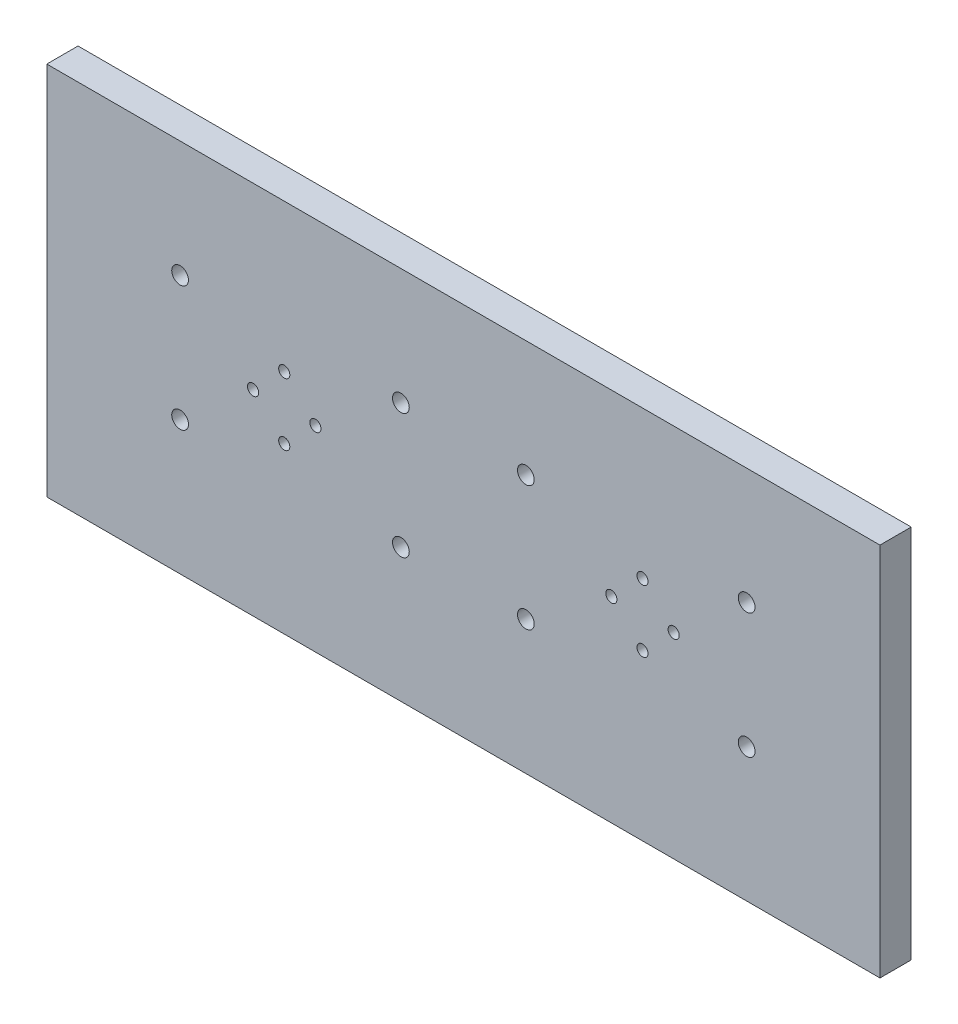
ISO-10303-21;
HEADER;
FILE_DESCRIPTION(('STEP AP214'),'2;1');
FILE_NAME('part.step','',(''),(''),'','','');
FILE_SCHEMA(('AUTOMOTIVE_DESIGN { 1 0 10303 214 1 1 1 1 }'));
ENDSEC;
DATA;
#1=APPLICATION_CONTEXT('core data for automotive mechanical design processes');
#2=APPLICATION_PROTOCOL_DEFINITION('international standard','automotive_design',2000,#1);
#3=PRODUCT_CONTEXT('',#1,'mechanical');
#4=PRODUCT('Part','Part','',(#3));
#5=PRODUCT_RELATED_PRODUCT_CATEGORY('part','',(#4));
#6=PRODUCT_DEFINITION_FORMATION('','',#4);
#7=PRODUCT_DEFINITION_CONTEXT('part definition',#1,'design');
#8=PRODUCT_DEFINITION('design','',#6,#7);
#9=PRODUCT_DEFINITION_SHAPE('','',#8);
#10=(LENGTH_UNIT() NAMED_UNIT(*) SI_UNIT(.MILLI.,.METRE.));
#11=(NAMED_UNIT(*) PLANE_ANGLE_UNIT() SI_UNIT($,.RADIAN.));
#12=(NAMED_UNIT(*) SI_UNIT($,.STERADIAN.) SOLID_ANGLE_UNIT());
#13=UNCERTAINTY_MEASURE_WITH_UNIT(LENGTH_MEASURE(1.E-05),#10,'distance_accuracy_value','');
#14=(GEOMETRIC_REPRESENTATION_CONTEXT(3) GLOBAL_UNCERTAINTY_ASSIGNED_CONTEXT((#13)) GLOBAL_UNIT_ASSIGNED_CONTEXT((#10,
#11,#12)) REPRESENTATION_CONTEXT('',''));
#15=CARTESIAN_POINT('',(0.,0.,0.));
#16=DIRECTION('',(0.,0.,1.));
#17=DIRECTION('',(1.,0.,0.));
#18=AXIS2_PLACEMENT_3D('',#15,#16,#17);
#19=CARTESIAN_POINT('',(127.,-57.15,9.525));
#20=DIRECTION('',(-1.,0.,0.));
#21=DIRECTION('',(0.,0.,1.));
#22=AXIS2_PLACEMENT_3D('',#19,#20,#21);
#23=PLANE('',#22);
#24=DIRECTION('',(0.,1.,0.));
#25=VECTOR('',#24,1.);
#26=CARTESIAN_POINT('',(127.,-57.15,0.));
#27=LINE('',#26,#25);
#28=CARTESIAN_POINT('',(127.,-57.15,0.));
#29=VERTEX_POINT('',#28);
#30=CARTESIAN_POINT('',(127.,57.15,0.));
#31=VERTEX_POINT('',#30);
#32=EDGE_CURVE('E108',#29,#31,#27,.T.);
#33=ORIENTED_EDGE('',*,*,#32,.T.);
#34=DIRECTION('',(0.,0.,-1.));
#35=VECTOR('',#34,1.);
#36=CARTESIAN_POINT('',(127.,57.15,9.525));
#37=LINE('',#36,#35);
#38=CARTESIAN_POINT('',(127.,57.15,9.525));
#39=VERTEX_POINT('',#38);
#40=EDGE_CURVE('E11',#39,#31,#37,.T.);
#41=ORIENTED_EDGE('',*,*,#40,.F.);
#42=DIRECTION('',(0.,1.,0.));
#43=VECTOR('',#42,1.);
#44=CARTESIAN_POINT('',(127.,-57.15,9.525));
#45=LINE('',#44,#43);
#46=CARTESIAN_POINT('',(127.,-57.15,9.525));
#47=VERTEX_POINT('',#46);
#48=EDGE_CURVE('E96',#47,#39,#45,.T.);
#49=ORIENTED_EDGE('',*,*,#48,.F.);
#50=DIRECTION('',(0.,0.,-1.));
#51=VECTOR('',#50,1.);
#52=CARTESIAN_POINT('',(127.,-57.15,9.525));
#53=LINE('',#52,#51);
#54=EDGE_CURVE('E104',#47,#29,#53,.T.);
#55=ORIENTED_EDGE('',*,*,#54,.T.);
#56=EDGE_LOOP('',(#33,#41,#49,#55));
#57=FACE_BOUND('',#56,.T.);
#58=ADVANCED_FACE('F44',(#57),#23,.F.);
#59=CARTESIAN_POINT('',(-127.,57.15,9.525));
#60=DIRECTION('',(0.,-1.,0.));
#61=DIRECTION('',(0.,0.,-1.));
#62=AXIS2_PLACEMENT_3D('',#59,#60,#61);
#63=PLANE('',#62);
#64=DIRECTION('',(-1.,0.,0.));
#65=VECTOR('',#64,1.);
#66=CARTESIAN_POINT('',(-127.,57.15,0.));
#67=LINE('',#66,#65);
#68=CARTESIAN_POINT('',(-127.,57.15,0.));
#69=VERTEX_POINT('',#68);
#70=EDGE_CURVE('E100',#31,#69,#67,.T.);
#71=ORIENTED_EDGE('',*,*,#70,.T.);
#72=DIRECTION('',(0.,0.,-1.));
#73=VECTOR('',#72,1.);
#74=CARTESIAN_POINT('',(-127.,57.15,9.525));
#75=LINE('',#74,#73);
#76=CARTESIAN_POINT('',(-127.,57.15,9.525));
#77=VERTEX_POINT('',#76);
#78=EDGE_CURVE('E52',#77,#69,#75,.T.);
#79=ORIENTED_EDGE('',*,*,#78,.F.);
#80=DIRECTION('',(-1.,0.,0.));
#81=VECTOR('',#80,1.);
#82=CARTESIAN_POINT('',(-127.,57.15,9.525));
#83=LINE('',#82,#81);
#84=EDGE_CURVE('E90',#39,#77,#83,.T.);
#85=ORIENTED_EDGE('',*,*,#84,.F.);
#86=ORIENTED_EDGE('',*,*,#40,.T.);
#87=EDGE_LOOP('',(#71,#79,#85,#86));
#88=FACE_BOUND('',#87,.T.);
#89=ADVANCED_FACE('F99',(#88),#63,.F.);
#90=CARTESIAN_POINT('',(-127.,-57.15,9.525));
#91=DIRECTION('',(1.,0.,0.));
#92=DIRECTION('',(0.,0.,-1.));
#93=AXIS2_PLACEMENT_3D('',#90,#91,#92);
#94=PLANE('',#93);
#95=DIRECTION('',(0.,-1.,0.));
#96=VECTOR('',#95,1.);
#97=CARTESIAN_POINT('',(-127.,-57.15,0.));
#98=LINE('',#97,#96);
#99=CARTESIAN_POINT('',(-127.,-57.15,0.));
#100=VERTEX_POINT('',#99);
#101=EDGE_CURVE('E77',#69,#100,#98,.T.);
#102=ORIENTED_EDGE('',*,*,#101,.T.);
#103=DIRECTION('',(0.,0.,-1.));
#104=VECTOR('',#103,1.);
#105=CARTESIAN_POINT('',(-127.,-57.15,9.525));
#106=LINE('',#105,#104);
#107=CARTESIAN_POINT('',(-127.,-57.15,9.525));
#108=VERTEX_POINT('',#107);
#109=EDGE_CURVE('E101',#108,#100,#106,.T.);
#110=ORIENTED_EDGE('',*,*,#109,.F.);
#111=DIRECTION('',(0.,-1.,0.));
#112=VECTOR('',#111,1.);
#113=CARTESIAN_POINT('',(-127.,-57.15,9.525));
#114=LINE('',#113,#112);
#115=EDGE_CURVE('E94',#77,#108,#114,.T.);
#116=ORIENTED_EDGE('',*,*,#115,.F.);
#117=ORIENTED_EDGE('',*,*,#78,.T.);
#118=EDGE_LOOP('',(#102,#110,#116,#117));
#119=FACE_BOUND('',#118,.T.);
#120=ADVANCED_FACE('F102',(#119),#94,.F.);
#121=CARTESIAN_POINT('',(-127.,-57.15,9.525));
#122=DIRECTION('',(0.,1.,0.));
#123=DIRECTION('',(0.,0.,1.));
#124=AXIS2_PLACEMENT_3D('',#121,#122,#123);
#125=PLANE('',#124);
#126=DIRECTION('',(1.,0.,0.));
#127=VECTOR('',#126,1.);
#128=CARTESIAN_POINT('',(-127.,-57.15,0.));
#129=LINE('',#128,#127);
#130=EDGE_CURVE('E83',#100,#29,#129,.T.);
#131=ORIENTED_EDGE('',*,*,#130,.T.);
#132=ORIENTED_EDGE('',*,*,#54,.F.);
#133=DIRECTION('',(1.,0.,0.));
#134=VECTOR('',#133,1.);
#135=CARTESIAN_POINT('',(-127.,-57.15,9.525));
#136=LINE('',#135,#134);
#137=EDGE_CURVE('E60',#108,#47,#136,.T.);
#138=ORIENTED_EDGE('',*,*,#137,.F.);
#139=ORIENTED_EDGE('',*,*,#109,.T.);
#140=EDGE_LOOP('',(#131,#132,#138,#139));
#141=FACE_BOUND('',#140,.T.);
#142=ADVANCED_FACE('F116',(#141),#125,.F.);
#143=CARTESIAN_POINT('',(0.,0.,9.525));
#144=DIRECTION('',(0.,0.,-1.));
#145=DIRECTION('',(-1.,0.,0.));
#146=AXIS2_PLACEMENT_3D('',#143,#144,#145);
#147=PLANE('',#146);
#148=CARTESIAN_POINT('',(-64.11,2.6416,9.525));
#149=DIRECTION('',(0.,0.,1.));
#150=DIRECTION('',(1.,0.,0.));
#151=AXIS2_PLACEMENT_3D('',#148,#149,#150);
#152=CIRCLE('',#151,1.70000000000001);
#153=CARTESIAN_POINT('',(-62.41,2.6416,9.525));
#154=VERTEX_POINT('',#153);
#155=EDGE_CURVE('E135',#154,#154,#152,.T.);
#156=ORIENTED_EDGE('',*,*,#155,.F.);
#157=EDGE_LOOP('',(#156));
#158=FACE_BOUND('',#157,.T.);
#159=ORIENTED_EDGE('',*,*,#48,.T.);
#160=ORIENTED_EDGE('',*,*,#84,.T.);
#161=ORIENTED_EDGE('',*,*,#115,.T.);
#162=ORIENTED_EDGE('',*,*,#137,.T.);
#163=EDGE_LOOP('',(#159,#160,#161,#162));
#164=FACE_BOUND('',#163,.T.);
#165=CARTESIAN_POINT('',(86.36,-16.4084,9.525));
#166=DIRECTION('',(0.,0.,1.));
#167=DIRECTION('',(1.,0.,0.));
#168=AXIS2_PLACEMENT_3D('',#165,#166,#167);
#169=CIRCLE('',#168,2.55270000000001);
#170=CARTESIAN_POINT('',(88.9127,-16.4084,9.525));
#171=VERTEX_POINT('',#170);
#172=EDGE_CURVE('E176',#171,#171,#169,.T.);
#173=ORIENTED_EDGE('',*,*,#172,.F.);
#174=EDGE_LOOP('',(#173));
#175=FACE_BOUND('',#174,.T.);
#176=CARTESIAN_POINT('',(19.05,-16.4084,9.525));
#177=DIRECTION('',(0.,0.,1.));
#178=DIRECTION('',(1.,0.,0.));
#179=AXIS2_PLACEMENT_3D('',#176,#177,#178);
#180=CIRCLE('',#179,2.5527);
#181=CARTESIAN_POINT('',(21.6027,-16.4084,9.525));
#182=VERTEX_POINT('',#181);
#183=EDGE_CURVE('E183',#182,#182,#180,.T.);
#184=ORIENTED_EDGE('',*,*,#183,.F.);
#185=EDGE_LOOP('',(#184));
#186=FACE_BOUND('',#185,.T.);
#187=CARTESIAN_POINT('',(19.05,21.6916,9.525));
#188=DIRECTION('',(0.,0.,1.));
#189=DIRECTION('',(1.,0.,0.));
#190=AXIS2_PLACEMENT_3D('',#187,#188,#189);
#191=CIRCLE('',#190,2.5527);
#192=CARTESIAN_POINT('',(21.6027,21.6916,9.525));
#193=VERTEX_POINT('',#192);
#194=EDGE_CURVE('E190',#193,#193,#191,.T.);
#195=ORIENTED_EDGE('',*,*,#194,.F.);
#196=EDGE_LOOP('',(#195));
#197=FACE_BOUND('',#196,.T.);
#198=CARTESIAN_POINT('',(-19.05,21.6916,9.525));
#199=DIRECTION('',(0.,0.,1.));
#200=DIRECTION('',(1.,0.,0.));
#201=AXIS2_PLACEMENT_3D('',#198,#199,#200);
#202=CIRCLE('',#201,2.5527);
#203=CARTESIAN_POINT('',(-16.4973,21.6916,9.525));
#204=VERTEX_POINT('',#203);
#205=EDGE_CURVE('E159',#204,#204,#202,.T.);
#206=ORIENTED_EDGE('',*,*,#205,.F.);
#207=EDGE_LOOP('',(#206));
#208=FACE_BOUND('',#207,.T.);
#209=CARTESIAN_POINT('',(-19.05,-16.4084,9.525));
#210=DIRECTION('',(0.,0.,1.));
#211=DIRECTION('',(1.,0.,0.));
#212=AXIS2_PLACEMENT_3D('',#209,#210,#211);
#213=CIRCLE('',#212,2.5527);
#214=CARTESIAN_POINT('',(-16.4973,-16.4084,9.525));
#215=VERTEX_POINT('',#214);
#216=EDGE_CURVE('E207',#215,#215,#213,.T.);
#217=ORIENTED_EDGE('',*,*,#216,.F.);
#218=EDGE_LOOP('',(#217));
#219=FACE_BOUND('',#218,.T.);
#220=CARTESIAN_POINT('',(-86.36,-16.4084,9.525));
#221=DIRECTION('',(0.,0.,1.));
#222=DIRECTION('',(1.,0.,0.));
#223=AXIS2_PLACEMENT_3D('',#220,#221,#222);
#224=CIRCLE('',#223,2.55270000000001);
#225=CARTESIAN_POINT('',(-83.8073,-16.4084,9.525));
#226=VERTEX_POINT('',#225);
#227=EDGE_CURVE('E200',#226,#226,#224,.T.);
#228=ORIENTED_EDGE('',*,*,#227,.F.);
#229=EDGE_LOOP('',(#228));
#230=FACE_BOUND('',#229,.T.);
#231=CARTESIAN_POINT('',(-86.36,21.6916,9.525));
#232=DIRECTION('',(0.,0.,1.));
#233=DIRECTION('',(1.,0.,0.));
#234=AXIS2_PLACEMENT_3D('',#231,#232,#233);
#235=CIRCLE('',#234,2.55270000000001);
#236=CARTESIAN_POINT('',(-83.8073,21.6916,9.525));
#237=VERTEX_POINT('',#236);
#238=EDGE_CURVE('E152',#237,#237,#235,.T.);
#239=ORIENTED_EDGE('',*,*,#238,.F.);
#240=EDGE_LOOP('',(#239));
#241=FACE_BOUND('',#240,.T.);
#242=CARTESIAN_POINT('',(86.36,21.6916,9.525));
#243=DIRECTION('',(0.,0.,1.));
#244=DIRECTION('',(1.,0.,0.));
#245=AXIS2_PLACEMENT_3D('',#242,#243,#244);
#246=CIRCLE('',#245,2.55270000000001);
#247=CARTESIAN_POINT('',(88.9127,21.6916,9.525));
#248=VERTEX_POINT('',#247);
#249=EDGE_CURVE('E184',#248,#248,#246,.T.);
#250=ORIENTED_EDGE('',*,*,#249,.F.);
#251=EDGE_LOOP('',(#250));
#252=FACE_BOUND('',#251,.T.);
#253=CARTESIAN_POINT('',(-54.61,-6.85839999999999,9.525));
#254=DIRECTION('',(0.,0.,1.));
#255=DIRECTION('',(1.,0.,0.));
#256=AXIS2_PLACEMENT_3D('',#253,#254,#255);
#257=CIRCLE('',#256,1.70000000000002);
#258=CARTESIAN_POINT('',(-52.91,-6.85839999999999,9.525));
#259=VERTEX_POINT('',#258);
#260=EDGE_CURVE('E128',#259,#259,#257,.T.);
#261=ORIENTED_EDGE('',*,*,#260,.F.);
#262=EDGE_LOOP('',(#261));
#263=FACE_BOUND('',#262,.T.);
#264=CARTESIAN_POINT('',(-54.61,12.1416,9.525));
#265=DIRECTION('',(0.,0.,1.));
#266=DIRECTION('',(1.,0.,0.));
#267=AXIS2_PLACEMENT_3D('',#264,#265,#266);
#268=CIRCLE('',#267,1.69999999999999);
#269=CARTESIAN_POINT('',(-52.91,12.1416,9.525));
#270=VERTEX_POINT('',#269);
#271=EDGE_CURVE('E127',#270,#270,#268,.T.);
#272=ORIENTED_EDGE('',*,*,#271,.F.);
#273=EDGE_LOOP('',(#272));
#274=FACE_BOUND('',#273,.T.);
#275=CARTESIAN_POINT('',(-45.11,2.64160000000001,9.525));
#276=DIRECTION('',(0.,0.,1.));
#277=DIRECTION('',(1.,0.,0.));
#278=AXIS2_PLACEMENT_3D('',#275,#276,#277);
#279=CIRCLE('',#278,1.70000000000001);
#280=CARTESIAN_POINT('',(-43.41,2.64160000000001,9.525));
#281=VERTEX_POINT('',#280);
#282=EDGE_CURVE('E124',#281,#281,#279,.T.);
#283=ORIENTED_EDGE('',*,*,#282,.F.);
#284=EDGE_LOOP('',(#283));
#285=FACE_BOUND('',#284,.T.);
#286=CARTESIAN_POINT('',(64.11,2.6416,9.525));
#287=DIRECTION('',(0.,0.,1.));
#288=DIRECTION('',(-1.,0.,0.));
#289=AXIS2_PLACEMENT_3D('',#286,#287,#288);
#290=CIRCLE('',#289,1.70000000000001);
#291=CARTESIAN_POINT('',(62.41,2.6416,9.525));
#292=VERTEX_POINT('',#291);
#293=EDGE_CURVE('E140',#292,#292,#290,.T.);
#294=ORIENTED_EDGE('',*,*,#293,.F.);
#295=EDGE_LOOP('',(#294));
#296=FACE_BOUND('',#295,.T.);
#297=CARTESIAN_POINT('',(54.61,-6.85839999999999,9.525));
#298=DIRECTION('',(0.,0.,1.));
#299=DIRECTION('',(-1.,0.,0.));
#300=AXIS2_PLACEMENT_3D('',#297,#298,#299);
#301=CIRCLE('',#300,1.70000000000002);
#302=CARTESIAN_POINT('',(52.91,-6.85839999999999,9.525));
#303=VERTEX_POINT('',#302);
#304=EDGE_CURVE('E147',#303,#303,#301,.T.);
#305=ORIENTED_EDGE('',*,*,#304,.F.);
#306=EDGE_LOOP('',(#305));
#307=FACE_BOUND('',#306,.T.);
#308=CARTESIAN_POINT('',(54.61,12.1416,9.525));
#309=DIRECTION('',(0.,0.,1.));
#310=DIRECTION('',(-1.,0.,0.));
#311=AXIS2_PLACEMENT_3D('',#308,#309,#310);
#312=CIRCLE('',#311,1.69999999999999);
#313=CARTESIAN_POINT('',(52.91,12.1416,9.525));
#314=VERTEX_POINT('',#313);
#315=EDGE_CURVE('E166',#314,#314,#312,.T.);
#316=ORIENTED_EDGE('',*,*,#315,.F.);
#317=EDGE_LOOP('',(#316));
#318=FACE_BOUND('',#317,.T.);
#319=CARTESIAN_POINT('',(45.11,2.64160000000001,9.525));
#320=DIRECTION('',(0.,0.,1.));
#321=DIRECTION('',(-1.,0.,0.));
#322=AXIS2_PLACEMENT_3D('',#319,#320,#321);
#323=CIRCLE('',#322,1.70000000000001);
#324=CARTESIAN_POINT('',(43.41,2.64160000000001,9.525));
#325=VERTEX_POINT('',#324);
#326=EDGE_CURVE('E160',#325,#325,#323,.T.);
#327=ORIENTED_EDGE('',*,*,#326,.F.);
#328=EDGE_LOOP('',(#327));
#329=FACE_BOUND('',#328,.T.);
#330=ADVANCED_FACE('F91',(#158,#164,#175,#186,#197,#208,#219,#230,#241,#252,#263,#274,#285,#296,
#307,#318,#329),#147,.F.);
#331=CARTESIAN_POINT('',(0.,0.,0.));
#332=DIRECTION('',(0.,0.,-1.));
#333=DIRECTION('',(-1.,0.,0.));
#334=AXIS2_PLACEMENT_3D('',#331,#332,#333);
#335=PLANE('',#334);
#336=CARTESIAN_POINT('',(-86.36,21.6916,0.));
#337=DIRECTION('',(0.,0.,-1.));
#338=DIRECTION('',(-1.,0.,0.));
#339=AXIS2_PLACEMENT_3D('',#336,#337,#338);
#340=CIRCLE('',#339,2.55270000000001);
#341=CARTESIAN_POINT('',(-88.9127,21.6916,0.));
#342=VERTEX_POINT('',#341);
#343=EDGE_CURVE('E156',#342,#342,#340,.F.);
#344=ORIENTED_EDGE('',*,*,#343,.T.);
#345=EDGE_LOOP('',(#344));
#346=FACE_BOUND('',#345,.T.);
#347=CARTESIAN_POINT('',(45.11,2.64160000000001,0.));
#348=DIRECTION('',(0.,0.,-1.));
#349=DIRECTION('',(-1.,0.,0.));
#350=AXIS2_PLACEMENT_3D('',#347,#348,#349);
#351=CIRCLE('',#350,1.70000000000001);
#352=CARTESIAN_POINT('',(43.41,2.64160000000001,0.));
#353=VERTEX_POINT('',#352);
#354=EDGE_CURVE('E155',#353,#353,#351,.F.);
#355=ORIENTED_EDGE('',*,*,#354,.T.);
#356=EDGE_LOOP('',(#355));
#357=FACE_BOUND('',#356,.T.);
#358=CARTESIAN_POINT('',(54.61,12.1416,0.));
#359=DIRECTION('',(0.,0.,-1.));
#360=DIRECTION('',(-1.,0.,0.));
#361=AXIS2_PLACEMENT_3D('',#358,#359,#360);
#362=CIRCLE('',#361,1.69999999999999);
#363=CARTESIAN_POINT('',(52.91,12.1416,0.));
#364=VERTEX_POINT('',#363);
#365=EDGE_CURVE('E163',#364,#364,#362,.F.);
#366=ORIENTED_EDGE('',*,*,#365,.T.);
#367=EDGE_LOOP('',(#366));
#368=FACE_BOUND('',#367,.T.);
#369=CARTESIAN_POINT('',(54.61,-6.85839999999999,0.));
#370=DIRECTION('',(0.,0.,-1.));
#371=DIRECTION('',(-1.,0.,0.));
#372=AXIS2_PLACEMENT_3D('',#369,#370,#371);
#373=CIRCLE('',#372,1.70000000000002);
#374=CARTESIAN_POINT('',(52.91,-6.85839999999999,0.));
#375=VERTEX_POINT('',#374);
#376=EDGE_CURVE('E169',#375,#375,#373,.F.);
#377=ORIENTED_EDGE('',*,*,#376,.T.);
#378=EDGE_LOOP('',(#377));
#379=FACE_BOUND('',#378,.T.);
#380=CARTESIAN_POINT('',(-54.61,12.1416,0.));
#381=DIRECTION('',(0.,0.,-1.));
#382=DIRECTION('',(-1.,0.,0.));
#383=AXIS2_PLACEMENT_3D('',#380,#381,#382);
#384=CIRCLE('',#383,1.69999999999999);
#385=CARTESIAN_POINT('',(-56.31,12.1416,0.));
#386=VERTEX_POINT('',#385);
#387=EDGE_CURVE('E131',#386,#386,#384,.F.);
#388=ORIENTED_EDGE('',*,*,#387,.T.);
#389=EDGE_LOOP('',(#388));
#390=FACE_BOUND('',#389,.T.);
#391=CARTESIAN_POINT('',(-54.61,-6.85839999999999,0.));
#392=DIRECTION('',(0.,0.,-1.));
#393=DIRECTION('',(-1.,0.,0.));
#394=AXIS2_PLACEMENT_3D('',#391,#392,#393);
#395=CIRCLE('',#394,1.70000000000002);
#396=CARTESIAN_POINT('',(-56.31,-6.85839999999999,0.));
#397=VERTEX_POINT('',#396);
#398=EDGE_CURVE('E132',#397,#397,#395,.F.);
#399=ORIENTED_EDGE('',*,*,#398,.T.);
#400=EDGE_LOOP('',(#399));
#401=FACE_BOUND('',#400,.T.);
#402=CARTESIAN_POINT('',(-64.11,2.6416,0.));
#403=DIRECTION('',(0.,0.,-1.));
#404=DIRECTION('',(-1.,0.,0.));
#405=AXIS2_PLACEMENT_3D('',#402,#403,#404);
#406=CIRCLE('',#405,1.70000000000001);
#407=CARTESIAN_POINT('',(-65.81,2.6416,0.));
#408=VERTEX_POINT('',#407);
#409=EDGE_CURVE('E143',#408,#408,#406,.F.);
#410=ORIENTED_EDGE('',*,*,#409,.T.);
#411=EDGE_LOOP('',(#410));
#412=FACE_BOUND('',#411,.T.);
#413=CARTESIAN_POINT('',(64.11,2.6416,0.));
#414=DIRECTION('',(0.,0.,-1.));
#415=DIRECTION('',(-1.,0.,0.));
#416=AXIS2_PLACEMENT_3D('',#413,#414,#415);
#417=CIRCLE('',#416,1.70000000000001);
#418=CARTESIAN_POINT('',(62.41,2.6416,0.));
#419=VERTEX_POINT('',#418);
#420=EDGE_CURVE('E144',#419,#419,#417,.F.);
#421=ORIENTED_EDGE('',*,*,#420,.T.);
#422=EDGE_LOOP('',(#421));
#423=FACE_BOUND('',#422,.T.);
#424=CARTESIAN_POINT('',(-86.36,-16.4084,0.));
#425=DIRECTION('',(0.,0.,-1.));
#426=DIRECTION('',(-1.,0.,0.));
#427=AXIS2_PLACEMENT_3D('',#424,#425,#426);
#428=CIRCLE('',#427,2.55270000000001);
#429=CARTESIAN_POINT('',(-88.9127,-16.4084,0.));
#430=VERTEX_POINT('',#429);
#431=EDGE_CURVE('E204',#430,#430,#428,.F.);
#432=ORIENTED_EDGE('',*,*,#431,.T.);
#433=EDGE_LOOP('',(#432));
#434=FACE_BOUND('',#433,.T.);
#435=CARTESIAN_POINT('',(-19.05,-16.4084,0.));
#436=DIRECTION('',(0.,0.,-1.));
#437=DIRECTION('',(-1.,0.,0.));
#438=AXIS2_PLACEMENT_3D('',#435,#436,#437);
#439=CIRCLE('',#438,2.5527);
#440=CARTESIAN_POINT('',(-21.6027,-16.4084,0.));
#441=VERTEX_POINT('',#440);
#442=EDGE_CURVE('E203',#441,#441,#439,.F.);
#443=ORIENTED_EDGE('',*,*,#442,.T.);
#444=EDGE_LOOP('',(#443));
#445=FACE_BOUND('',#444,.T.);
#446=CARTESIAN_POINT('',(19.05,-16.4084,0.));
#447=DIRECTION('',(0.,0.,-1.));
#448=DIRECTION('',(-1.,0.,0.));
#449=AXIS2_PLACEMENT_3D('',#446,#447,#448);
#450=CIRCLE('',#449,2.5527);
#451=CARTESIAN_POINT('',(16.4973,-16.4084,0.));
#452=VERTEX_POINT('',#451);
#453=EDGE_CURVE('E210',#452,#452,#450,.F.);
#454=ORIENTED_EDGE('',*,*,#453,.T.);
#455=EDGE_LOOP('',(#454));
#456=FACE_BOUND('',#455,.T.);
#457=CARTESIAN_POINT('',(86.36,-16.4084,0.));
#458=DIRECTION('',(0.,0.,-1.));
#459=DIRECTION('',(-1.,0.,0.));
#460=AXIS2_PLACEMENT_3D('',#457,#458,#459);
#461=CIRCLE('',#460,2.55270000000001);
#462=CARTESIAN_POINT('',(83.8073,-16.4084,0.));
#463=VERTEX_POINT('',#462);
#464=EDGE_CURVE('E180',#463,#463,#461,.F.);
#465=ORIENTED_EDGE('',*,*,#464,.T.);
#466=EDGE_LOOP('',(#465));
#467=FACE_BOUND('',#466,.T.);
#468=CARTESIAN_POINT('',(86.36,21.6916,0.));
#469=DIRECTION('',(0.,0.,-1.));
#470=DIRECTION('',(-1.,0.,0.));
#471=AXIS2_PLACEMENT_3D('',#468,#469,#470);
#472=CIRCLE('',#471,2.55270000000001);
#473=CARTESIAN_POINT('',(83.8073,21.6916,0.));
#474=VERTEX_POINT('',#473);
#475=EDGE_CURVE('E179',#474,#474,#472,.F.);
#476=ORIENTED_EDGE('',*,*,#475,.T.);
#477=EDGE_LOOP('',(#476));
#478=FACE_BOUND('',#477,.T.);
#479=CARTESIAN_POINT('',(19.05,21.6916,0.));
#480=DIRECTION('',(0.,0.,-1.));
#481=DIRECTION('',(-1.,0.,0.));
#482=AXIS2_PLACEMENT_3D('',#479,#480,#481);
#483=CIRCLE('',#482,2.5527);
#484=CARTESIAN_POINT('',(16.4973,21.6916,0.));
#485=VERTEX_POINT('',#484);
#486=EDGE_CURVE('E187',#485,#485,#483,.F.);
#487=ORIENTED_EDGE('',*,*,#486,.T.);
#488=EDGE_LOOP('',(#487));
#489=FACE_BOUND('',#488,.T.);
#490=CARTESIAN_POINT('',(-19.05,21.6916,0.));
#491=DIRECTION('',(0.,0.,-1.));
#492=DIRECTION('',(-1.,0.,0.));
#493=AXIS2_PLACEMENT_3D('',#490,#491,#492);
#494=CIRCLE('',#493,2.5527);
#495=CARTESIAN_POINT('',(-21.6027,21.6916,0.));
#496=VERTEX_POINT('',#495);
#497=EDGE_CURVE('E193',#496,#496,#494,.F.);
#498=ORIENTED_EDGE('',*,*,#497,.T.);
#499=EDGE_LOOP('',(#498));
#500=FACE_BOUND('',#499,.T.);
#501=CARTESIAN_POINT('',(-45.11,2.64160000000001,0.));
#502=DIRECTION('',(0.,0.,-1.));
#503=DIRECTION('',(-1.,0.,0.));
#504=AXIS2_PLACEMENT_3D('',#501,#502,#503);
#505=CIRCLE('',#504,1.70000000000001);
#506=CARTESIAN_POINT('',(-46.81,2.64160000000001,0.));
#507=VERTEX_POINT('',#506);
#508=EDGE_CURVE('E111',#507,#507,#505,.F.);
#509=ORIENTED_EDGE('',*,*,#508,.T.);
#510=EDGE_LOOP('',(#509));
#511=FACE_BOUND('',#510,.T.);
#512=ORIENTED_EDGE('',*,*,#32,.F.);
#513=ORIENTED_EDGE('',*,*,#130,.F.);
#514=ORIENTED_EDGE('',*,*,#101,.F.);
#515=ORIENTED_EDGE('',*,*,#70,.F.);
#516=EDGE_LOOP('',(#512,#513,#514,#515));
#517=FACE_BOUND('',#516,.T.);
#518=ADVANCED_FACE('F119',(#346,#357,#368,#379,#390,#401,#412,#423,#434,#445,#456,#467,#478,
#489,#500,#511,#517),#335,.T.);
#519=CARTESIAN_POINT('',(-45.11,2.64160000000001,-7.22012592133962));
#520=DIRECTION('',(0.,0.,1.));
#521=DIRECTION('',(1.,0.,0.));
#522=AXIS2_PLACEMENT_3D('',#519,#520,#521);
#523=CYLINDRICAL_SURFACE('',#522,1.70000000000001);
#524=ORIENTED_EDGE('',*,*,#282,.T.);
#525=EDGE_LOOP('',(#524));
#526=FACE_BOUND('',#525,.T.);
#527=ORIENTED_EDGE('',*,*,#508,.F.);
#528=EDGE_LOOP('',(#527));
#529=FACE_BOUND('',#528,.T.);
#530=ADVANCED_FACE('F250',(#526,#529),#523,.F.);
#531=CARTESIAN_POINT('',(-19.05,21.6916,-7.22012592133962));
#532=DIRECTION('',(0.,0.,1.));
#533=DIRECTION('',(1.,0.,0.));
#534=AXIS2_PLACEMENT_3D('',#531,#532,#533);
#535=CYLINDRICAL_SURFACE('',#534,2.5527);
#536=ORIENTED_EDGE('',*,*,#205,.T.);
#537=EDGE_LOOP('',(#536));
#538=FACE_BOUND('',#537,.T.);
#539=ORIENTED_EDGE('',*,*,#497,.F.);
#540=EDGE_LOOP('',(#539));
#541=FACE_BOUND('',#540,.T.);
#542=ADVANCED_FACE('F257',(#538,#541),#535,.F.);
#543=CARTESIAN_POINT('',(19.05,21.6916,-7.22012592133962));
#544=DIRECTION('',(0.,0.,1.));
#545=DIRECTION('',(1.,0.,0.));
#546=AXIS2_PLACEMENT_3D('',#543,#544,#545);
#547=CYLINDRICAL_SURFACE('',#546,2.5527);
#548=ORIENTED_EDGE('',*,*,#194,.T.);
#549=EDGE_LOOP('',(#548));
#550=FACE_BOUND('',#549,.T.);
#551=ORIENTED_EDGE('',*,*,#486,.F.);
#552=EDGE_LOOP('',(#551));
#553=FACE_BOUND('',#552,.T.);
#554=ADVANCED_FACE('F293',(#550,#553),#547,.F.);
#555=CARTESIAN_POINT('',(86.36,21.6916,-7.22012592133962));
#556=DIRECTION('',(0.,0.,1.));
#557=DIRECTION('',(1.,0.,0.));
#558=AXIS2_PLACEMENT_3D('',#555,#556,#557);
#559=CYLINDRICAL_SURFACE('',#558,2.55270000000001);
#560=ORIENTED_EDGE('',*,*,#249,.T.);
#561=EDGE_LOOP('',(#560));
#562=FACE_BOUND('',#561,.T.);
#563=ORIENTED_EDGE('',*,*,#475,.F.);
#564=EDGE_LOOP('',(#563));
#565=FACE_BOUND('',#564,.T.);
#566=ADVANCED_FACE('F233',(#562,#565),#559,.F.);
#567=CARTESIAN_POINT('',(86.36,-16.4084,-7.22012592133962));
#568=DIRECTION('',(0.,0.,1.));
#569=DIRECTION('',(1.,0.,0.));
#570=AXIS2_PLACEMENT_3D('',#567,#568,#569);
#571=CYLINDRICAL_SURFACE('',#570,2.55270000000001);
#572=ORIENTED_EDGE('',*,*,#172,.T.);
#573=EDGE_LOOP('',(#572));
#574=FACE_BOUND('',#573,.T.);
#575=ORIENTED_EDGE('',*,*,#464,.F.);
#576=EDGE_LOOP('',(#575));
#577=FACE_BOUND('',#576,.T.);
#578=ADVANCED_FACE('F223',(#574,#577),#571,.F.);
#579=CARTESIAN_POINT('',(19.05,-16.4084,-7.22012592133962));
#580=DIRECTION('',(0.,0.,1.));
#581=DIRECTION('',(1.,0.,0.));
#582=AXIS2_PLACEMENT_3D('',#579,#580,#581);
#583=CYLINDRICAL_SURFACE('',#582,2.5527);
#584=ORIENTED_EDGE('',*,*,#183,.T.);
#585=EDGE_LOOP('',(#584));
#586=FACE_BOUND('',#585,.T.);
#587=ORIENTED_EDGE('',*,*,#453,.F.);
#588=EDGE_LOOP('',(#587));
#589=FACE_BOUND('',#588,.T.);
#590=ADVANCED_FACE('F220',(#586,#589),#583,.F.);
#591=CARTESIAN_POINT('',(-19.05,-16.4084,-7.22012592133962));
#592=DIRECTION('',(0.,0.,1.));
#593=DIRECTION('',(1.,0.,0.));
#594=AXIS2_PLACEMENT_3D('',#591,#592,#593);
#595=CYLINDRICAL_SURFACE('',#594,2.5527);
#596=ORIENTED_EDGE('',*,*,#216,.T.);
#597=EDGE_LOOP('',(#596));
#598=FACE_BOUND('',#597,.T.);
#599=ORIENTED_EDGE('',*,*,#442,.F.);
#600=EDGE_LOOP('',(#599));
#601=FACE_BOUND('',#600,.T.);
#602=ADVANCED_FACE('F222',(#598,#601),#595,.F.);
#603=CARTESIAN_POINT('',(-86.36,-16.4084,-7.22012592133962));
#604=DIRECTION('',(0.,0.,1.));
#605=DIRECTION('',(1.,0.,0.));
#606=AXIS2_PLACEMENT_3D('',#603,#604,#605);
#607=CYLINDRICAL_SURFACE('',#606,2.55270000000001);
#608=ORIENTED_EDGE('',*,*,#227,.T.);
#609=EDGE_LOOP('',(#608));
#610=FACE_BOUND('',#609,.T.);
#611=ORIENTED_EDGE('',*,*,#431,.F.);
#612=EDGE_LOOP('',(#611));
#613=FACE_BOUND('',#612,.T.);
#614=ADVANCED_FACE('F230',(#610,#613),#607,.F.);
#615=CARTESIAN_POINT('',(64.11,2.6416,-7.22012592133962));
#616=DIRECTION('',(0.,0.,1.));
#617=DIRECTION('',(1.,0.,0.));
#618=AXIS2_PLACEMENT_3D('',#615,#616,#617);
#619=CYLINDRICAL_SURFACE('',#618,1.70000000000001);
#620=ORIENTED_EDGE('',*,*,#293,.T.);
#621=EDGE_LOOP('',(#620));
#622=FACE_BOUND('',#621,.T.);
#623=ORIENTED_EDGE('',*,*,#420,.F.);
#624=EDGE_LOOP('',(#623));
#625=FACE_BOUND('',#624,.T.);
#626=ADVANCED_FACE('F269',(#622,#625),#619,.F.);
#627=CARTESIAN_POINT('',(-64.11,2.6416,-7.22012592133962));
#628=DIRECTION('',(0.,0.,1.));
#629=DIRECTION('',(1.,0.,0.));
#630=AXIS2_PLACEMENT_3D('',#627,#628,#629);
#631=CYLINDRICAL_SURFACE('',#630,1.70000000000001);
#632=ORIENTED_EDGE('',*,*,#155,.T.);
#633=EDGE_LOOP('',(#632));
#634=FACE_BOUND('',#633,.T.);
#635=ORIENTED_EDGE('',*,*,#409,.F.);
#636=EDGE_LOOP('',(#635));
#637=FACE_BOUND('',#636,.T.);
#638=ADVANCED_FACE('F263',(#634,#637),#631,.F.);
#639=CARTESIAN_POINT('',(-54.61,-6.85839999999999,-7.22012592133962));
#640=DIRECTION('',(0.,0.,1.));
#641=DIRECTION('',(1.,0.,0.));
#642=AXIS2_PLACEMENT_3D('',#639,#640,#641);
#643=CYLINDRICAL_SURFACE('',#642,1.70000000000002);
#644=ORIENTED_EDGE('',*,*,#260,.T.);
#645=EDGE_LOOP('',(#644));
#646=FACE_BOUND('',#645,.T.);
#647=ORIENTED_EDGE('',*,*,#398,.F.);
#648=EDGE_LOOP('',(#647));
#649=FACE_BOUND('',#648,.T.);
#650=ADVANCED_FACE('F259',(#646,#649),#643,.F.);
#651=CARTESIAN_POINT('',(-54.61,12.1416,-7.22012592133962));
#652=DIRECTION('',(0.,0.,1.));
#653=DIRECTION('',(1.,0.,0.));
#654=AXIS2_PLACEMENT_3D('',#651,#652,#653);
#655=CYLINDRICAL_SURFACE('',#654,1.69999999999999);
#656=ORIENTED_EDGE('',*,*,#271,.T.);
#657=EDGE_LOOP('',(#656));
#658=FACE_BOUND('',#657,.T.);
#659=ORIENTED_EDGE('',*,*,#387,.F.);
#660=EDGE_LOOP('',(#659));
#661=FACE_BOUND('',#660,.T.);
#662=ADVANCED_FACE('F262',(#658,#661),#655,.F.);
#663=CARTESIAN_POINT('',(54.61,-6.85839999999999,-7.22012592133962));
#664=DIRECTION('',(0.,0.,1.));
#665=DIRECTION('',(1.,0.,0.));
#666=AXIS2_PLACEMENT_3D('',#663,#664,#665);
#667=CYLINDRICAL_SURFACE('',#666,1.70000000000002);
#668=ORIENTED_EDGE('',*,*,#304,.T.);
#669=EDGE_LOOP('',(#668));
#670=FACE_BOUND('',#669,.T.);
#671=ORIENTED_EDGE('',*,*,#376,.F.);
#672=EDGE_LOOP('',(#671));
#673=FACE_BOUND('',#672,.T.);
#674=ADVANCED_FACE('F267',(#670,#673),#667,.F.);
#675=CARTESIAN_POINT('',(54.61,12.1416,-7.22012592133962));
#676=DIRECTION('',(0.,0.,1.));
#677=DIRECTION('',(1.,0.,0.));
#678=AXIS2_PLACEMENT_3D('',#675,#676,#677);
#679=CYLINDRICAL_SURFACE('',#678,1.69999999999999);
#680=ORIENTED_EDGE('',*,*,#315,.T.);
#681=EDGE_LOOP('',(#680));
#682=FACE_BOUND('',#681,.T.);
#683=ORIENTED_EDGE('',*,*,#365,.F.);
#684=EDGE_LOOP('',(#683));
#685=FACE_BOUND('',#684,.T.);
#686=ADVANCED_FACE('F283',(#682,#685),#679,.F.);
#687=CARTESIAN_POINT('',(45.11,2.64160000000001,-7.22012592133962));
#688=DIRECTION('',(0.,0.,1.));
#689=DIRECTION('',(1.,0.,0.));
#690=AXIS2_PLACEMENT_3D('',#687,#688,#689);
#691=CYLINDRICAL_SURFACE('',#690,1.70000000000001);
#692=ORIENTED_EDGE('',*,*,#326,.T.);
#693=EDGE_LOOP('',(#692));
#694=FACE_BOUND('',#693,.T.);
#695=ORIENTED_EDGE('',*,*,#354,.F.);
#696=EDGE_LOOP('',(#695));
#697=FACE_BOUND('',#696,.T.);
#698=ADVANCED_FACE('F279',(#694,#697),#691,.F.);
#699=CARTESIAN_POINT('',(-86.36,21.6916,-7.22012592133962));
#700=DIRECTION('',(0.,0.,1.));
#701=DIRECTION('',(1.,0.,0.));
#702=AXIS2_PLACEMENT_3D('',#699,#700,#701);
#703=CYLINDRICAL_SURFACE('',#702,2.55270000000001);
#704=ORIENTED_EDGE('',*,*,#238,.T.);
#705=EDGE_LOOP('',(#704));
#706=FACE_BOUND('',#705,.T.);
#707=ORIENTED_EDGE('',*,*,#343,.F.);
#708=EDGE_LOOP('',(#707));
#709=FACE_BOUND('',#708,.T.);
#710=ADVANCED_FACE('F276',(#706,#709),#703,.F.);
#711=CLOSED_SHELL('',(#58,#89,#120,#142,#330,#518,#530,#542,#554,#566,#578,#590,#602,#614,#626,
#638,#650,#662,#674,#686,#698,#710));
#712=MANIFOLD_SOLID_BREP('B2',#711);
#713=ADVANCED_BREP_SHAPE_REPRESENTATION('',(#18,#712),#14);
#714=SHAPE_DEFINITION_REPRESENTATION(#9,#713);
ENDSEC;
END-ISO-10303-21;
